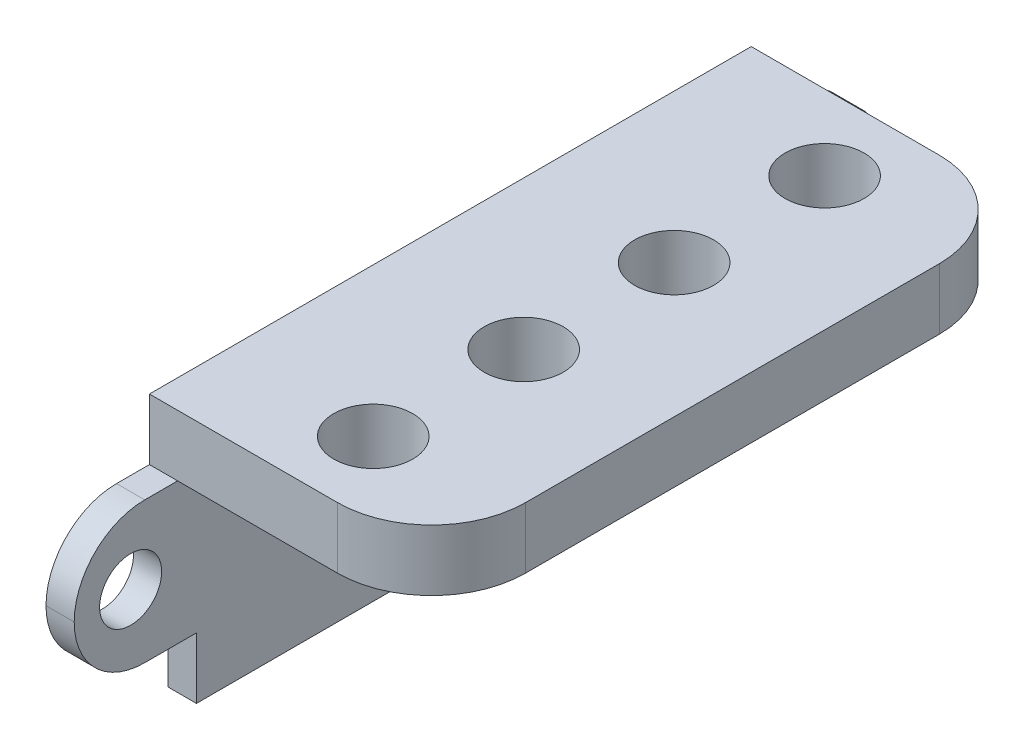
ISO-10303-21;
HEADER;
FILE_DESCRIPTION(('STEP AP214'),'2;1');
FILE_NAME('part.step','',(''),(''),'','','');
FILE_SCHEMA(('AUTOMOTIVE_DESIGN { 1 0 10303 214 1 1 1 1 }'));
ENDSEC;
DATA;
#1=APPLICATION_CONTEXT('core data for automotive mechanical design processes');
#2=APPLICATION_PROTOCOL_DEFINITION('international standard','automotive_design',2000,#1);
#3=PRODUCT_CONTEXT('',#1,'mechanical');
#4=PRODUCT('Part','Part','',(#3));
#5=PRODUCT_RELATED_PRODUCT_CATEGORY('part','',(#4));
#6=PRODUCT_DEFINITION_FORMATION('','',#4);
#7=PRODUCT_DEFINITION_CONTEXT('part definition',#1,'design');
#8=PRODUCT_DEFINITION('design','',#6,#7);
#9=PRODUCT_DEFINITION_SHAPE('','',#8);
#10=(LENGTH_UNIT() NAMED_UNIT(*) SI_UNIT(.MILLI.,.METRE.));
#11=(NAMED_UNIT(*) PLANE_ANGLE_UNIT() SI_UNIT($,.RADIAN.));
#12=(NAMED_UNIT(*) SI_UNIT($,.STERADIAN.) SOLID_ANGLE_UNIT());
#13=UNCERTAINTY_MEASURE_WITH_UNIT(LENGTH_MEASURE(1.E-05),#10,'distance_accuracy_value','');
#14=(GEOMETRIC_REPRESENTATION_CONTEXT(3) GLOBAL_UNCERTAINTY_ASSIGNED_CONTEXT((#13)) GLOBAL_UNIT_ASSIGNED_CONTEXT((#10,
#11,#12)) REPRESENTATION_CONTEXT('',''));
#15=CARTESIAN_POINT('',(0.,0.,0.));
#16=DIRECTION('',(0.,0.,1.));
#17=DIRECTION('',(1.,0.,0.));
#18=AXIS2_PLACEMENT_3D('',#15,#16,#17);
#19=CARTESIAN_POINT('',(1.5,0.,0.));
#20=DIRECTION('',(1.,0.,0.));
#21=DIRECTION('',(0.,0.,-1.));
#22=AXIS2_PLACEMENT_3D('',#19,#20,#21);
#23=PLANE('',#22);
#24=CARTESIAN_POINT('',(1.5,0.,-18.5));
#25=DIRECTION('',(1.,0.,0.));
#26=DIRECTION('',(0.,0.,-1.));
#27=AXIS2_PLACEMENT_3D('',#24,#25,#26);
#28=CIRCLE('',#27,1.65);
#29=CARTESIAN_POINT('',(1.5,0.,-20.15));
#30=VERTEX_POINT('',#29);
#31=EDGE_CURVE('E219',#30,#30,#28,.T.);
#32=ORIENTED_EDGE('',*,*,#31,.F.);
#33=EDGE_LOOP('',(#32));
#34=FACE_BOUND('',#33,.T.);
#35=CARTESIAN_POINT('',(1.5,0.,18.5));
#36=DIRECTION('',(1.,0.,0.));
#37=DIRECTION('',(0.,0.,-1.));
#38=AXIS2_PLACEMENT_3D('',#35,#36,#37);
#39=CIRCLE('',#38,1.65);
#40=CARTESIAN_POINT('',(1.5,0.,16.85));
#41=VERTEX_POINT('',#40);
#42=EDGE_CURVE('E224',#41,#41,#39,.T.);
#43=ORIENTED_EDGE('',*,*,#42,.F.);
#44=EDGE_LOOP('',(#43));
#45=FACE_BOUND('',#44,.T.);
#46=DIRECTION('',(0.,0.,1.));
#47=VECTOR('',#46,1.);
#48=CARTESIAN_POINT('',(1.5,3.75,21.5));
#49=LINE('',#48,#47);
#50=CARTESIAN_POINT('',(1.5,3.75,-17.75));
#51=VERTEX_POINT('',#50);
#52=CARTESIAN_POINT('',(1.5,3.75,-16.));
#53=VERTEX_POINT('',#52);
#54=EDGE_CURVE('E228',#51,#53,#49,.T.);
#55=ORIENTED_EDGE('',*,*,#54,.T.);
#56=CARTESIAN_POINT('',(1.5,3.75,16.));
#57=VERTEX_POINT('',#56);
#58=EDGE_CURVE('E232',#53,#57,#49,.T.);
#59=ORIENTED_EDGE('',*,*,#58,.T.);
#60=CARTESIAN_POINT('',(1.5,3.75,17.75));
#61=VERTEX_POINT('',#60);
#62=EDGE_CURVE('E233',#57,#61,#49,.T.);
#63=ORIENTED_EDGE('',*,*,#62,.T.);
#64=CARTESIAN_POINT('',(1.5,0.,17.75));
#65=DIRECTION('',(1.,0.,0.));
#66=DIRECTION('',(0.,0.,-1.));
#67=AXIS2_PLACEMENT_3D('',#64,#65,#66);
#68=CIRCLE('',#67,3.75);
#69=CARTESIAN_POINT('',(1.5,0.,21.5));
#70=VERTEX_POINT('',#69);
#71=EDGE_CURVE('E261',#61,#70,#68,.T.);
#72=ORIENTED_EDGE('',*,*,#71,.T.);
#73=CARTESIAN_POINT('',(1.5,0.,17.75));
#74=DIRECTION('',(1.,0.,0.));
#75=DIRECTION('',(0.,0.,-1.));
#76=AXIS2_PLACEMENT_3D('',#73,#74,#75);
#77=CIRCLE('',#76,3.75);
#78=CARTESIAN_POINT('',(1.5,-3.75,17.75));
#79=VERTEX_POINT('',#78);
#80=EDGE_CURVE('E263',#70,#79,#77,.T.);
#81=ORIENTED_EDGE('',*,*,#80,.T.);
#82=DIRECTION('',(0.,0.,-1.));
#83=VECTOR('',#82,1.);
#84=CARTESIAN_POINT('',(1.5,-3.75,21.5));
#85=LINE('',#84,#83);
#86=CARTESIAN_POINT('',(1.5,-3.75,15.));
#87=VERTEX_POINT('',#86);
#88=EDGE_CURVE('E234',#79,#87,#85,.T.);
#89=ORIENTED_EDGE('',*,*,#88,.T.);
#90=DIRECTION('',(0.,1.,0.));
#91=VECTOR('',#90,1.);
#92=CARTESIAN_POINT('',(1.5,-7.,15.));
#93=LINE('',#92,#91);
#94=CARTESIAN_POINT('',(1.5,-7.,15.));
#95=VERTEX_POINT('',#94);
#96=EDGE_CURVE('E199',#95,#87,#93,.T.);
#97=ORIENTED_EDGE('',*,*,#96,.F.);
#98=DIRECTION('',(0.,0.,1.));
#99=VECTOR('',#98,1.);
#100=CARTESIAN_POINT('',(1.5,-7.,15.));
#101=LINE('',#100,#99);
#102=CARTESIAN_POINT('',(1.5,-7.,-15.));
#103=VERTEX_POINT('',#102);
#104=EDGE_CURVE('E196',#103,#95,#101,.T.);
#105=ORIENTED_EDGE('',*,*,#104,.F.);
#106=DIRECTION('',(0.,-1.,0.));
#107=VECTOR('',#106,1.);
#108=CARTESIAN_POINT('',(1.5,-7.,-15.));
#109=LINE('',#108,#107);
#110=CARTESIAN_POINT('',(1.5,-3.75,-15.));
#111=VERTEX_POINT('',#110);
#112=EDGE_CURVE('E164',#111,#103,#109,.T.);
#113=ORIENTED_EDGE('',*,*,#112,.F.);
#114=CARTESIAN_POINT('',(1.5,-3.75,-17.75));
#115=VERTEX_POINT('',#114);
#116=EDGE_CURVE('E231',#111,#115,#85,.T.);
#117=ORIENTED_EDGE('',*,*,#116,.T.);
#118=CARTESIAN_POINT('',(1.5,0.,-17.75));
#119=DIRECTION('',(1.,0.,0.));
#120=DIRECTION('',(0.,0.,-1.));
#121=AXIS2_PLACEMENT_3D('',#118,#119,#120);
#122=CIRCLE('',#121,3.75);
#123=CARTESIAN_POINT('',(1.5,0.,-21.5));
#124=VERTEX_POINT('',#123);
#125=EDGE_CURVE('E267',#115,#124,#122,.T.);
#126=ORIENTED_EDGE('',*,*,#125,.T.);
#127=CARTESIAN_POINT('',(1.5,0.,-17.75));
#128=DIRECTION('',(1.,0.,0.));
#129=DIRECTION('',(0.,0.,-1.));
#130=AXIS2_PLACEMENT_3D('',#127,#128,#129);
#131=CIRCLE('',#130,3.75);
#132=EDGE_CURVE('E265',#124,#51,#131,.T.);
#133=ORIENTED_EDGE('',*,*,#132,.T.);
#134=EDGE_LOOP('',(#55,#59,#63,#72,#81,#89,#97,#105,#113,#117,#126,#133));
#135=FACE_BOUND('',#134,.T.);
#136=ADVANCED_FACE('F32',(#34,#45,#135),#23,.T.);
#137=CARTESIAN_POINT('',(1.5,3.75,21.5));
#138=DIRECTION('',(0.,-1.,0.));
#139=DIRECTION('',(0.,0.,-1.));
#140=AXIS2_PLACEMENT_3D('',#137,#138,#139);
#141=PLANE('',#140);
#142=DIRECTION('',(0.,0.,1.));
#143=VECTOR('',#142,1.);
#144=CARTESIAN_POINT('',(0.,3.75,21.5));
#145=LINE('',#144,#143);
#146=CARTESIAN_POINT('',(0.,3.75,-17.75));
#147=VERTEX_POINT('',#146);
#148=CARTESIAN_POINT('',(0.,3.75,-16.));
#149=VERTEX_POINT('',#148);
#150=EDGE_CURVE('E238',#147,#149,#145,.T.);
#151=ORIENTED_EDGE('',*,*,#150,.T.);
#152=DIRECTION('',(-1.,0.,0.));
#153=VECTOR('',#152,1.);
#154=CARTESIAN_POINT('',(0.,3.74999999999999,-16.));
#155=LINE('',#154,#153);
#156=EDGE_CURVE('E299',#53,#149,#155,.T.);
#157=ORIENTED_EDGE('',*,*,#156,.F.);
#158=ORIENTED_EDGE('',*,*,#54,.F.);
#159=DIRECTION('',(-1.,0.,0.));
#160=VECTOR('',#159,1.);
#161=CARTESIAN_POINT('',(1.5,3.75,-17.75));
#162=LINE('',#161,#160);
#163=EDGE_CURVE('E272',#51,#147,#162,.T.);
#164=ORIENTED_EDGE('',*,*,#163,.T.);
#165=EDGE_LOOP('',(#151,#157,#158,#164));
#166=FACE_BOUND('',#165,.T.);
#167=ADVANCED_FACE('F399',(#166),#141,.F.);
#168=CARTESIAN_POINT('',(1.5,-3.75,21.5));
#169=DIRECTION('',(0.,1.,0.));
#170=DIRECTION('',(0.,0.,1.));
#171=AXIS2_PLACEMENT_3D('',#168,#169,#170);
#172=PLANE('',#171);
#173=ORIENTED_EDGE('',*,*,#116,.F.);
#174=DIRECTION('',(-1.,0.,0.));
#175=VECTOR('',#174,1.);
#176=CARTESIAN_POINT('',(1.5,-3.75,-15.));
#177=LINE('',#176,#175);
#178=CARTESIAN_POINT('',(0.,-3.75,-15.));
#179=VERTEX_POINT('',#178);
#180=EDGE_CURVE('E215',#111,#179,#177,.T.);
#181=ORIENTED_EDGE('',*,*,#180,.T.);
#182=DIRECTION('',(0.,0.,-1.));
#183=VECTOR('',#182,1.);
#184=CARTESIAN_POINT('',(0.,-3.75,21.5));
#185=LINE('',#184,#183);
#186=CARTESIAN_POINT('',(0.,-3.75,-17.75));
#187=VERTEX_POINT('',#186);
#188=EDGE_CURVE('E240',#179,#187,#185,.T.);
#189=ORIENTED_EDGE('',*,*,#188,.T.);
#190=DIRECTION('',(-1.,0.,0.));
#191=VECTOR('',#190,1.);
#192=CARTESIAN_POINT('',(1.5,-3.75,-17.75));
#193=LINE('',#192,#191);
#194=EDGE_CURVE('E258',#187,#115,#193,.F.);
#195=ORIENTED_EDGE('',*,*,#194,.T.);
#196=EDGE_LOOP('',(#173,#181,#189,#195));
#197=FACE_BOUND('',#196,.T.);
#198=ADVANCED_FACE('F321',(#197),#172,.F.);
#199=ORIENTED_EDGE('',*,*,#62,.F.);
#200=DIRECTION('',(1.,0.,0.));
#201=VECTOR('',#200,1.);
#202=CARTESIAN_POINT('',(0.,3.75,16.));
#203=LINE('',#202,#201);
#204=CARTESIAN_POINT('',(0.,3.75,16.));
#205=VERTEX_POINT('',#204);
#206=EDGE_CURVE('E300',#205,#57,#203,.T.);
#207=ORIENTED_EDGE('',*,*,#206,.F.);
#208=CARTESIAN_POINT('',(0.,3.75,17.75));
#209=VERTEX_POINT('',#208);
#210=EDGE_CURVE('E173',#205,#209,#145,.T.);
#211=ORIENTED_EDGE('',*,*,#210,.T.);
#212=DIRECTION('',(-1.,0.,0.));
#213=VECTOR('',#212,1.);
#214=CARTESIAN_POINT('',(1.5,3.75,17.75));
#215=LINE('',#214,#213);
#216=EDGE_CURVE('E269',#209,#61,#215,.F.);
#217=ORIENTED_EDGE('',*,*,#216,.T.);
#218=EDGE_LOOP('',(#199,#207,#211,#217));
#219=FACE_BOUND('',#218,.T.);
#220=ADVANCED_FACE('F351',(#219),#141,.F.);
#221=CARTESIAN_POINT('',(0.,-3.75,17.75));
#222=VERTEX_POINT('',#221);
#223=CARTESIAN_POINT('',(0.,-3.75,15.));
#224=VERTEX_POINT('',#223);
#225=EDGE_CURVE('E241',#222,#224,#185,.T.);
#226=ORIENTED_EDGE('',*,*,#225,.T.);
#227=DIRECTION('',(1.,0.,0.));
#228=VECTOR('',#227,1.);
#229=CARTESIAN_POINT('',(1.5,-3.75,15.));
#230=LINE('',#229,#228);
#231=EDGE_CURVE('E211',#224,#87,#230,.T.);
#232=ORIENTED_EDGE('',*,*,#231,.T.);
#233=ORIENTED_EDGE('',*,*,#88,.F.);
#234=DIRECTION('',(-1.,0.,0.));
#235=VECTOR('',#234,1.);
#236=CARTESIAN_POINT('',(1.5,-3.75,17.75));
#237=LINE('',#236,#235);
#238=EDGE_CURVE('E255',#79,#222,#237,.T.);
#239=ORIENTED_EDGE('',*,*,#238,.T.);
#240=EDGE_LOOP('',(#226,#232,#233,#239));
#241=FACE_BOUND('',#240,.T.);
#242=ADVANCED_FACE('F338',(#241),#172,.F.);
#243=CARTESIAN_POINT('',(0.,0.,0.));
#244=DIRECTION('',(1.,0.,0.));
#245=DIRECTION('',(0.,0.,-1.));
#246=AXIS2_PLACEMENT_3D('',#243,#244,#245);
#247=PLANE('',#246);
#248=DIRECTION('',(0.,0.,-1.));
#249=VECTOR('',#248,1.);
#250=CARTESIAN_POINT('',(0.,7.,15.));
#251=LINE('',#250,#249);
#252=CARTESIAN_POINT('',(0.,7.,16.));
#253=VERTEX_POINT('',#252);
#254=CARTESIAN_POINT('',(0.,7.,-16.));
#255=VERTEX_POINT('',#254);
#256=EDGE_CURVE('E154',#253,#255,#251,.T.);
#257=ORIENTED_EDGE('',*,*,#256,.T.);
#258=DIRECTION('',(0.,1.,0.));
#259=VECTOR('',#258,1.);
#260=CARTESIAN_POINT('',(0.,3.74999999999999,-16.));
#261=LINE('',#260,#259);
#262=EDGE_CURVE('E176',#149,#255,#261,.T.);
#263=ORIENTED_EDGE('',*,*,#262,.F.);
#264=ORIENTED_EDGE('',*,*,#150,.F.);
#265=CARTESIAN_POINT('',(0.,0.,-17.75));
#266=DIRECTION('',(1.,0.,0.));
#267=DIRECTION('',(0.,0.,-1.));
#268=AXIS2_PLACEMENT_3D('',#265,#266,#267);
#269=CIRCLE('',#268,3.75);
#270=CARTESIAN_POINT('',(0.,0.,-21.5));
#271=VERTEX_POINT('',#270);
#272=EDGE_CURVE('E250',#147,#271,#269,.F.);
#273=ORIENTED_EDGE('',*,*,#272,.T.);
#274=CARTESIAN_POINT('',(0.,0.,-17.75));
#275=DIRECTION('',(1.,0.,0.));
#276=DIRECTION('',(0.,0.,-1.));
#277=AXIS2_PLACEMENT_3D('',#274,#275,#276);
#278=CIRCLE('',#277,3.75);
#279=EDGE_CURVE('E252',#271,#187,#278,.F.);
#280=ORIENTED_EDGE('',*,*,#279,.T.);
#281=ORIENTED_EDGE('',*,*,#188,.F.);
#282=DIRECTION('',(0.,-1.,0.));
#283=VECTOR('',#282,1.);
#284=CARTESIAN_POINT('',(0.,-7.,-15.));
#285=LINE('',#284,#283);
#286=CARTESIAN_POINT('',(0.,-7.,-15.));
#287=VERTEX_POINT('',#286);
#288=EDGE_CURVE('E193',#179,#287,#285,.T.);
#289=ORIENTED_EDGE('',*,*,#288,.T.);
#290=DIRECTION('',(0.,0.,1.));
#291=VECTOR('',#290,1.);
#292=CARTESIAN_POINT('',(0.,-7.,15.));
#293=LINE('',#292,#291);
#294=CARTESIAN_POINT('',(0.,-7.,15.));
#295=VERTEX_POINT('',#294);
#296=EDGE_CURVE('E204',#287,#295,#293,.T.);
#297=ORIENTED_EDGE('',*,*,#296,.T.);
#298=DIRECTION('',(0.,1.,0.));
#299=VECTOR('',#298,1.);
#300=CARTESIAN_POINT('',(0.,-7.,15.));
#301=LINE('',#300,#299);
#302=EDGE_CURVE('E165',#295,#224,#301,.T.);
#303=ORIENTED_EDGE('',*,*,#302,.T.);
#304=ORIENTED_EDGE('',*,*,#225,.F.);
#305=CARTESIAN_POINT('',(0.,0.,17.75));
#306=DIRECTION('',(1.,0.,0.));
#307=DIRECTION('',(0.,0.,-1.));
#308=AXIS2_PLACEMENT_3D('',#305,#306,#307);
#309=CIRCLE('',#308,3.75);
#310=CARTESIAN_POINT('',(0.,0.,21.5));
#311=VERTEX_POINT('',#310);
#312=EDGE_CURVE('E248',#222,#311,#309,.F.);
#313=ORIENTED_EDGE('',*,*,#312,.T.);
#314=CARTESIAN_POINT('',(0.,0.,17.75));
#315=DIRECTION('',(1.,0.,0.));
#316=DIRECTION('',(0.,0.,-1.));
#317=AXIS2_PLACEMENT_3D('',#314,#315,#316);
#318=CIRCLE('',#317,3.75);
#319=EDGE_CURVE('E237',#311,#209,#318,.F.);
#320=ORIENTED_EDGE('',*,*,#319,.T.);
#321=ORIENTED_EDGE('',*,*,#210,.F.);
#322=DIRECTION('',(0.,1.,0.));
#323=VECTOR('',#322,1.);
#324=CARTESIAN_POINT('',(0.,3.75,16.));
#325=LINE('',#324,#323);
#326=EDGE_CURVE('E169',#205,#253,#325,.T.);
#327=ORIENTED_EDGE('',*,*,#326,.T.);
#328=EDGE_LOOP('',(#257,#263,#264,#273,#280,#281,#289,#297,#303,#304,#313,#320,#321,#327));
#329=FACE_BOUND('',#328,.T.);
#330=CARTESIAN_POINT('',(0.,0.,-18.5));
#331=DIRECTION('',(1.,0.,0.));
#332=DIRECTION('',(0.,0.,-1.));
#333=AXIS2_PLACEMENT_3D('',#330,#331,#332);
#334=CIRCLE('',#333,1.65);
#335=CARTESIAN_POINT('',(0.,0.,-20.15));
#336=VERTEX_POINT('',#335);
#337=EDGE_CURVE('E222',#336,#336,#334,.T.);
#338=ORIENTED_EDGE('',*,*,#337,.T.);
#339=EDGE_LOOP('',(#338));
#340=FACE_BOUND('',#339,.T.);
#341=CARTESIAN_POINT('',(0.,0.,18.5));
#342=DIRECTION('',(1.,0.,0.));
#343=DIRECTION('',(0.,0.,-1.));
#344=AXIS2_PLACEMENT_3D('',#341,#342,#343);
#345=CIRCLE('',#344,1.65);
#346=CARTESIAN_POINT('',(0.,0.,16.85));
#347=VERTEX_POINT('',#346);
#348=EDGE_CURVE('E227',#347,#347,#345,.T.);
#349=ORIENTED_EDGE('',*,*,#348,.T.);
#350=EDGE_LOOP('',(#349));
#351=FACE_BOUND('',#350,.T.);
#352=ADVANCED_FACE('F170',(#329,#340,#351),#247,.F.);
#353=CARTESIAN_POINT('',(-10.,0.,18.5));
#354=DIRECTION('',(1.,0.,0.));
#355=DIRECTION('',(0.,0.,-1.));
#356=AXIS2_PLACEMENT_3D('',#353,#354,#355);
#357=CYLINDRICAL_SURFACE('',#356,1.65);
#358=ORIENTED_EDGE('',*,*,#42,.T.);
#359=EDGE_LOOP('',(#358));
#360=FACE_BOUND('',#359,.T.);
#361=ORIENTED_EDGE('',*,*,#348,.F.);
#362=EDGE_LOOP('',(#361));
#363=FACE_BOUND('',#362,.T.);
#364=ADVANCED_FACE('F410',(#360,#363),#357,.F.);
#365=CARTESIAN_POINT('',(-10.,0.,-18.5));
#366=DIRECTION('',(1.,0.,0.));
#367=DIRECTION('',(0.,0.,-1.));
#368=AXIS2_PLACEMENT_3D('',#365,#366,#367);
#369=CYLINDRICAL_SURFACE('',#368,1.65);
#370=ORIENTED_EDGE('',*,*,#31,.T.);
#371=EDGE_LOOP('',(#370));
#372=FACE_BOUND('',#371,.T.);
#373=ORIENTED_EDGE('',*,*,#337,.F.);
#374=EDGE_LOOP('',(#373));
#375=FACE_BOUND('',#374,.T.);
#376=ADVANCED_FACE('F421',(#372,#375),#369,.F.);
#377=CARTESIAN_POINT('',(1.5,0.,-17.75));
#378=DIRECTION('',(-1.,0.,0.));
#379=DIRECTION('',(0.,0.,1.));
#380=AXIS2_PLACEMENT_3D('',#377,#378,#379);
#381=CYLINDRICAL_SURFACE('',#380,3.75);
#382=ORIENTED_EDGE('',*,*,#163,.F.);
#383=ORIENTED_EDGE('',*,*,#132,.F.);
#384=DIRECTION('',(-1.,0.,0.));
#385=VECTOR('',#384,1.);
#386=CARTESIAN_POINT('',(1.5,0.,-21.5));
#387=LINE('',#386,#385);
#388=EDGE_CURVE('E223',#271,#124,#387,.F.);
#389=ORIENTED_EDGE('',*,*,#388,.F.);
#390=ORIENTED_EDGE('',*,*,#272,.F.);
#391=EDGE_LOOP('',(#382,#383,#389,#390));
#392=FACE_BOUND('',#391,.T.);
#393=ADVANCED_FACE('F311',(#392),#381,.T.);
#394=CARTESIAN_POINT('',(1.5,0.,-17.75));
#395=DIRECTION('',(-1.,0.,0.));
#396=DIRECTION('',(0.,0.,1.));
#397=AXIS2_PLACEMENT_3D('',#394,#395,#396);
#398=CYLINDRICAL_SURFACE('',#397,3.75);
#399=ORIENTED_EDGE('',*,*,#125,.F.);
#400=ORIENTED_EDGE('',*,*,#194,.F.);
#401=ORIENTED_EDGE('',*,*,#279,.F.);
#402=ORIENTED_EDGE('',*,*,#388,.T.);
#403=EDGE_LOOP('',(#399,#400,#401,#402));
#404=FACE_BOUND('',#403,.T.);
#405=ADVANCED_FACE('F317',(#404),#398,.T.);
#406=CARTESIAN_POINT('',(1.5,0.,17.75));
#407=DIRECTION('',(-1.,0.,0.));
#408=DIRECTION('',(0.,0.,1.));
#409=AXIS2_PLACEMENT_3D('',#406,#407,#408);
#410=CYLINDRICAL_SURFACE('',#409,3.75);
#411=DIRECTION('',(-1.,0.,0.));
#412=VECTOR('',#411,1.);
#413=CARTESIAN_POINT('',(1.5,0.,21.5));
#414=LINE('',#413,#412);
#415=EDGE_CURVE('E218',#70,#311,#414,.T.);
#416=ORIENTED_EDGE('',*,*,#415,.F.);
#417=ORIENTED_EDGE('',*,*,#71,.F.);
#418=ORIENTED_EDGE('',*,*,#216,.F.);
#419=ORIENTED_EDGE('',*,*,#319,.F.);
#420=EDGE_LOOP('',(#416,#417,#418,#419));
#421=FACE_BOUND('',#420,.T.);
#422=ADVANCED_FACE('F349',(#421),#410,.T.);
#423=CARTESIAN_POINT('',(1.5,0.,17.75));
#424=DIRECTION('',(-1.,0.,0.));
#425=DIRECTION('',(0.,0.,1.));
#426=AXIS2_PLACEMENT_3D('',#423,#424,#425);
#427=CYLINDRICAL_SURFACE('',#426,3.75);
#428=ORIENTED_EDGE('',*,*,#80,.F.);
#429=ORIENTED_EDGE('',*,*,#415,.T.);
#430=ORIENTED_EDGE('',*,*,#312,.F.);
#431=ORIENTED_EDGE('',*,*,#238,.F.);
#432=EDGE_LOOP('',(#428,#429,#430,#431));
#433=FACE_BOUND('',#432,.T.);
#434=ADVANCED_FACE('F345',(#433),#427,.T.);
#435=CARTESIAN_POINT('',(1.5,-7.,15.));
#436=DIRECTION('',(0.,-1.,0.));
#437=DIRECTION('',(0.,0.,-1.));
#438=AXIS2_PLACEMENT_3D('',#435,#436,#437);
#439=PLANE('',#438);
#440=ORIENTED_EDGE('',*,*,#296,.F.);
#441=DIRECTION('',(-1.,0.,0.));
#442=VECTOR('',#441,1.);
#443=CARTESIAN_POINT('',(1.5,-7.,-15.));
#444=LINE('',#443,#442);
#445=EDGE_CURVE('E202',#103,#287,#444,.T.);
#446=ORIENTED_EDGE('',*,*,#445,.F.);
#447=ORIENTED_EDGE('',*,*,#104,.T.);
#448=DIRECTION('',(-1.,0.,0.));
#449=VECTOR('',#448,1.);
#450=CARTESIAN_POINT('',(1.5,-7.,15.));
#451=LINE('',#450,#449);
#452=EDGE_CURVE('E209',#95,#295,#451,.T.);
#453=ORIENTED_EDGE('',*,*,#452,.T.);
#454=EDGE_LOOP('',(#440,#446,#447,#453));
#455=FACE_BOUND('',#454,.T.);
#456=ADVANCED_FACE('F329',(#455),#439,.T.);
#457=CARTESIAN_POINT('',(1.5,-7.,15.));
#458=DIRECTION('',(0.,0.,1.));
#459=DIRECTION('',(1.,0.,0.));
#460=AXIS2_PLACEMENT_3D('',#457,#458,#459);
#461=PLANE('',#460);
#462=ORIENTED_EDGE('',*,*,#231,.F.);
#463=ORIENTED_EDGE('',*,*,#302,.F.);
#464=ORIENTED_EDGE('',*,*,#452,.F.);
#465=ORIENTED_EDGE('',*,*,#96,.T.);
#466=EDGE_LOOP('',(#462,#463,#464,#465));
#467=FACE_BOUND('',#466,.T.);
#468=ADVANCED_FACE('F334',(#467),#461,.T.);
#469=CARTESIAN_POINT('',(1.5,-7.,-15.));
#470=DIRECTION('',(0.,0.,-1.));
#471=DIRECTION('',(-1.,0.,0.));
#472=AXIS2_PLACEMENT_3D('',#469,#470,#471);
#473=PLANE('',#472);
#474=ORIENTED_EDGE('',*,*,#180,.F.);
#475=ORIENTED_EDGE('',*,*,#112,.T.);
#476=ORIENTED_EDGE('',*,*,#445,.T.);
#477=ORIENTED_EDGE('',*,*,#288,.F.);
#478=EDGE_LOOP('',(#474,#475,#476,#477));
#479=FACE_BOUND('',#478,.T.);
#480=ADVANCED_FACE('F324',(#479),#473,.T.);
#481=CARTESIAN_POINT('',(1.5,7.,15.));
#482=DIRECTION('',(0.,1.,0.));
#483=DIRECTION('',(0.,0.,1.));
#484=AXIS2_PLACEMENT_3D('',#481,#482,#483);
#485=PLANE('',#484);
#486=CARTESIAN_POINT('',(7.90000000000025,7.,-12.));
#487=DIRECTION('',(0.,1.,0.));
#488=DIRECTION('',(0.,0.,1.));
#489=AXIS2_PLACEMENT_3D('',#486,#487,#488);
#490=CIRCLE('',#489,2.1);
#491=CARTESIAN_POINT('',(7.90000000000025,7.,-9.9));
#492=VERTEX_POINT('',#491);
#493=EDGE_CURVE('E369',#492,#492,#490,.T.);
#494=ORIENTED_EDGE('',*,*,#493,.F.);
#495=EDGE_LOOP('',(#494));
#496=FACE_BOUND('',#495,.T.);
#497=CARTESIAN_POINT('',(7.90000000000017,7.,-4.));
#498=DIRECTION('',(0.,1.,0.));
#499=DIRECTION('',(0.,0.,1.));
#500=AXIS2_PLACEMENT_3D('',#497,#498,#499);
#501=CIRCLE('',#500,2.1);
#502=CARTESIAN_POINT('',(7.90000000000017,7.,-1.9));
#503=VERTEX_POINT('',#502);
#504=EDGE_CURVE('E363',#503,#503,#501,.T.);
#505=ORIENTED_EDGE('',*,*,#504,.F.);
#506=EDGE_LOOP('',(#505));
#507=FACE_BOUND('',#506,.T.);
#508=CARTESIAN_POINT('',(7.90000000000008,7.,4.));
#509=DIRECTION('',(0.,1.,0.));
#510=DIRECTION('',(0.,0.,1.));
#511=AXIS2_PLACEMENT_3D('',#508,#509,#510);
#512=CIRCLE('',#511,2.1);
#513=CARTESIAN_POINT('',(7.90000000000008,7.,6.1));
#514=VERTEX_POINT('',#513);
#515=EDGE_CURVE('E357',#514,#514,#512,.T.);
#516=ORIENTED_EDGE('',*,*,#515,.F.);
#517=EDGE_LOOP('',(#516));
#518=FACE_BOUND('',#517,.T.);
#519=CARTESIAN_POINT('',(7.9,7.,12.));
#520=DIRECTION('',(0.,1.,0.));
#521=DIRECTION('',(0.,0.,1.));
#522=AXIS2_PLACEMENT_3D('',#519,#520,#521);
#523=CIRCLE('',#522,2.1);
#524=CARTESIAN_POINT('',(7.9,7.,14.1));
#525=VERTEX_POINT('',#524);
#526=EDGE_CURVE('E182',#525,#525,#523,.T.);
#527=ORIENTED_EDGE('',*,*,#526,.F.);
#528=EDGE_LOOP('',(#527));
#529=FACE_BOUND('',#528,.T.);
#530=DIRECTION('',(0.,0.,-1.));
#531=VECTOR('',#530,1.);
#532=CARTESIAN_POINT('',(15.,7.,-16.));
#533=LINE('',#532,#531);
#534=CARTESIAN_POINT('',(15.,7.,11.));
#535=VERTEX_POINT('',#534);
#536=CARTESIAN_POINT('',(15.,7.,-11.));
#537=VERTEX_POINT('',#536);
#538=EDGE_CURVE('E181',#535,#537,#533,.T.);
#539=ORIENTED_EDGE('',*,*,#538,.T.);
#540=CARTESIAN_POINT('',(10.,7.,-11.));
#541=DIRECTION('',(0.,1.,0.));
#542=DIRECTION('',(0.,0.,1.));
#543=AXIS2_PLACEMENT_3D('',#540,#541,#542);
#544=CIRCLE('',#543,5.);
#545=CARTESIAN_POINT('',(10.,7.,-16.));
#546=VERTEX_POINT('',#545);
#547=EDGE_CURVE('E285',#537,#546,#544,.T.);
#548=ORIENTED_EDGE('',*,*,#547,.T.);
#549=DIRECTION('',(-1.,0.,0.));
#550=VECTOR('',#549,1.);
#551=CARTESIAN_POINT('',(0.,7.,-16.));
#552=LINE('',#551,#550);
#553=EDGE_CURVE('E160',#546,#255,#552,.T.);
#554=ORIENTED_EDGE('',*,*,#553,.T.);
#555=ORIENTED_EDGE('',*,*,#256,.F.);
#556=DIRECTION('',(1.,0.,0.));
#557=VECTOR('',#556,1.);
#558=CARTESIAN_POINT('',(0.,7.,16.));
#559=LINE('',#558,#557);
#560=CARTESIAN_POINT('',(10.,7.,16.));
#561=VERTEX_POINT('',#560);
#562=EDGE_CURVE('E159',#253,#561,#559,.T.);
#563=ORIENTED_EDGE('',*,*,#562,.T.);
#564=CARTESIAN_POINT('',(10.,7.,11.));
#565=DIRECTION('',(0.,1.,0.));
#566=DIRECTION('',(0.,0.,1.));
#567=AXIS2_PLACEMENT_3D('',#564,#565,#566);
#568=CIRCLE('',#567,5.);
#569=EDGE_CURVE('E283',#561,#535,#568,.T.);
#570=ORIENTED_EDGE('',*,*,#569,.T.);
#571=EDGE_LOOP('',(#539,#548,#554,#555,#563,#570));
#572=FACE_BOUND('',#571,.T.);
#573=ADVANCED_FACE('F157',(#496,#507,#518,#529,#572),#485,.T.);
#574=CARTESIAN_POINT('',(0.,3.74999999999999,-16.));
#575=DIRECTION('',(0.,0.,-1.));
#576=DIRECTION('',(0.,1.,0.));
#577=AXIS2_PLACEMENT_3D('',#574,#575,#576);
#578=PLANE('',#577);
#579=ORIENTED_EDGE('',*,*,#553,.F.);
#580=DIRECTION('',(0.,1.,0.));
#581=VECTOR('',#580,1.);
#582=CARTESIAN_POINT('',(10.,3.74999999999999,-16.));
#583=LINE('',#582,#581);
#584=CARTESIAN_POINT('',(10.,3.74999999999999,-16.));
#585=VERTEX_POINT('',#584);
#586=EDGE_CURVE('E55',#546,#585,#583,.F.);
#587=ORIENTED_EDGE('',*,*,#586,.T.);
#588=EDGE_CURVE('E177',#585,#53,#155,.T.);
#589=ORIENTED_EDGE('',*,*,#588,.T.);
#590=ORIENTED_EDGE('',*,*,#156,.T.);
#591=ORIENTED_EDGE('',*,*,#262,.T.);
#592=EDGE_LOOP('',(#579,#587,#589,#590,#591));
#593=FACE_BOUND('',#592,.T.);
#594=ADVANCED_FACE('F302',(#593),#578,.T.);
#595=CARTESIAN_POINT('',(15.,3.74999999999999,-16.));
#596=DIRECTION('',(1.,0.,0.));
#597=DIRECTION('',(0.,0.,-1.));
#598=AXIS2_PLACEMENT_3D('',#595,#596,#597);
#599=PLANE('',#598);
#600=DIRECTION('',(0.,0.,-1.));
#601=VECTOR('',#600,1.);
#602=CARTESIAN_POINT('',(15.,3.74999999999999,-16.));
#603=LINE('',#602,#601);
#604=CARTESIAN_POINT('',(15.,3.75,11.));
#605=VERTEX_POINT('',#604);
#606=CARTESIAN_POINT('',(15.,3.75,-11.));
#607=VERTEX_POINT('',#606);
#608=EDGE_CURVE('E291',#605,#607,#603,.T.);
#609=ORIENTED_EDGE('',*,*,#608,.T.);
#610=DIRECTION('',(0.,1.,0.));
#611=VECTOR('',#610,1.);
#612=CARTESIAN_POINT('',(15.,3.75,-11.));
#613=LINE('',#612,#611);
#614=EDGE_CURVE('E280',#607,#537,#613,.T.);
#615=ORIENTED_EDGE('',*,*,#614,.T.);
#616=ORIENTED_EDGE('',*,*,#538,.F.);
#617=DIRECTION('',(0.,1.,0.));
#618=VECTOR('',#617,1.);
#619=CARTESIAN_POINT('',(15.,3.75,11.));
#620=LINE('',#619,#618);
#621=EDGE_CURVE('E274',#535,#605,#620,.F.);
#622=ORIENTED_EDGE('',*,*,#621,.T.);
#623=EDGE_LOOP('',(#609,#615,#616,#622));
#624=FACE_BOUND('',#623,.T.);
#625=ADVANCED_FACE('F296',(#624),#599,.T.);
#626=CARTESIAN_POINT('',(0.,3.75,16.));
#627=DIRECTION('',(0.,0.,1.));
#628=DIRECTION('',(1.,0.,0.));
#629=AXIS2_PLACEMENT_3D('',#626,#627,#628);
#630=PLANE('',#629);
#631=CARTESIAN_POINT('',(10.,3.75,16.));
#632=VERTEX_POINT('',#631);
#633=EDGE_CURVE('E192',#57,#632,#203,.T.);
#634=ORIENTED_EDGE('',*,*,#633,.T.);
#635=DIRECTION('',(0.,1.,0.));
#636=VECTOR('',#635,1.);
#637=CARTESIAN_POINT('',(10.,3.75,16.));
#638=LINE('',#637,#636);
#639=EDGE_CURVE('E11',#632,#561,#638,.T.);
#640=ORIENTED_EDGE('',*,*,#639,.T.);
#641=ORIENTED_EDGE('',*,*,#562,.F.);
#642=ORIENTED_EDGE('',*,*,#326,.F.);
#643=ORIENTED_EDGE('',*,*,#206,.T.);
#644=EDGE_LOOP('',(#634,#640,#641,#642,#643));
#645=FACE_BOUND('',#644,.T.);
#646=ADVANCED_FACE('F179',(#645),#630,.T.);
#647=CARTESIAN_POINT('',(0.,3.75,0.));
#648=DIRECTION('',(0.,1.,0.));
#649=DIRECTION('',(0.,0.,1.));
#650=AXIS2_PLACEMENT_3D('',#647,#648,#649);
#651=PLANE('',#650);
#652=CARTESIAN_POINT('',(7.90000000000025,3.75,-12.));
#653=DIRECTION('',(0.,-1.,0.));
#654=DIRECTION('',(0.,0.,-1.));
#655=AXIS2_PLACEMENT_3D('',#652,#653,#654);
#656=CIRCLE('',#655,2.1);
#657=CARTESIAN_POINT('',(7.90000000000025,3.74999999999999,-14.1));
#658=VERTEX_POINT('',#657);
#659=EDGE_CURVE('E372',#658,#658,#656,.T.);
#660=ORIENTED_EDGE('',*,*,#659,.F.);
#661=EDGE_LOOP('',(#660));
#662=FACE_BOUND('',#661,.T.);
#663=CARTESIAN_POINT('',(7.90000000000017,3.75,-4.));
#664=DIRECTION('',(0.,-1.,0.));
#665=DIRECTION('',(0.,0.,-1.));
#666=AXIS2_PLACEMENT_3D('',#663,#664,#665);
#667=CIRCLE('',#666,2.1);
#668=CARTESIAN_POINT('',(7.90000000000017,3.75,-6.1));
#669=VERTEX_POINT('',#668);
#670=EDGE_CURVE('E366',#669,#669,#667,.T.);
#671=ORIENTED_EDGE('',*,*,#670,.F.);
#672=EDGE_LOOP('',(#671));
#673=FACE_BOUND('',#672,.T.);
#674=CARTESIAN_POINT('',(7.90000000000008,3.75,4.));
#675=DIRECTION('',(0.,-1.,0.));
#676=DIRECTION('',(0.,0.,-1.));
#677=AXIS2_PLACEMENT_3D('',#674,#675,#676);
#678=CIRCLE('',#677,2.1);
#679=CARTESIAN_POINT('',(7.90000000000008,3.75,1.9));
#680=VERTEX_POINT('',#679);
#681=EDGE_CURVE('E360',#680,#680,#678,.T.);
#682=ORIENTED_EDGE('',*,*,#681,.F.);
#683=EDGE_LOOP('',(#682));
#684=FACE_BOUND('',#683,.T.);
#685=CARTESIAN_POINT('',(7.9,3.75,12.));
#686=DIRECTION('',(0.,-1.,0.));
#687=DIRECTION('',(0.,0.,-1.));
#688=AXIS2_PLACEMENT_3D('',#685,#686,#687);
#689=CIRCLE('',#688,2.1);
#690=CARTESIAN_POINT('',(7.9,3.75,9.9));
#691=VERTEX_POINT('',#690);
#692=EDGE_CURVE('E186',#691,#691,#689,.T.);
#693=ORIENTED_EDGE('',*,*,#692,.F.);
#694=EDGE_LOOP('',(#693));
#695=FACE_BOUND('',#694,.T.);
#696=ORIENTED_EDGE('',*,*,#588,.F.);
#697=CARTESIAN_POINT('',(10.,3.75,-11.));
#698=DIRECTION('',(0.,1.,0.));
#699=DIRECTION('',(0.,0.,1.));
#700=AXIS2_PLACEMENT_3D('',#697,#698,#699);
#701=CIRCLE('',#700,5.);
#702=EDGE_CURVE('E40',#585,#607,#701,.F.);
#703=ORIENTED_EDGE('',*,*,#702,.T.);
#704=ORIENTED_EDGE('',*,*,#608,.F.);
#705=CARTESIAN_POINT('',(10.,3.75,11.));
#706=DIRECTION('',(0.,1.,0.));
#707=DIRECTION('',(0.,0.,1.));
#708=AXIS2_PLACEMENT_3D('',#705,#706,#707);
#709=CIRCLE('',#708,5.);
#710=EDGE_CURVE('E47',#605,#632,#709,.F.);
#711=ORIENTED_EDGE('',*,*,#710,.T.);
#712=ORIENTED_EDGE('',*,*,#633,.F.);
#713=ORIENTED_EDGE('',*,*,#58,.F.);
#714=EDGE_LOOP('',(#696,#703,#704,#711,#712,#713));
#715=FACE_BOUND('',#714,.T.);
#716=ADVANCED_FACE('F290',(#662,#673,#684,#695,#715),#651,.F.);
#717=CARTESIAN_POINT('',(7.9,16.75,12.));
#718=DIRECTION('',(0.,-1.,0.));
#719=DIRECTION('',(0.,0.,-1.));
#720=AXIS2_PLACEMENT_3D('',#717,#718,#719);
#721=CYLINDRICAL_SURFACE('',#720,2.1);
#722=ORIENTED_EDGE('',*,*,#526,.T.);
#723=EDGE_LOOP('',(#722));
#724=FACE_BOUND('',#723,.T.);
#725=ORIENTED_EDGE('',*,*,#692,.T.);
#726=EDGE_LOOP('',(#725));
#727=FACE_BOUND('',#726,.T.);
#728=ADVANCED_FACE('F380',(#724,#727),#721,.F.);
#729=CARTESIAN_POINT('',(7.90000000000008,16.75,4.));
#730=DIRECTION('',(0.,-1.,0.));
#731=DIRECTION('',(0.,0.,-1.));
#732=AXIS2_PLACEMENT_3D('',#729,#730,#731);
#733=CYLINDRICAL_SURFACE('',#732,2.1);
#734=ORIENTED_EDGE('',*,*,#515,.T.);
#735=EDGE_LOOP('',(#734));
#736=FACE_BOUND('',#735,.T.);
#737=ORIENTED_EDGE('',*,*,#681,.T.);
#738=EDGE_LOOP('',(#737));
#739=FACE_BOUND('',#738,.T.);
#740=ADVANCED_FACE('F389',(#736,#739),#733,.F.);
#741=CARTESIAN_POINT('',(7.90000000000017,16.75,-4.));
#742=DIRECTION('',(0.,-1.,0.));
#743=DIRECTION('',(0.,0.,-1.));
#744=AXIS2_PLACEMENT_3D('',#741,#742,#743);
#745=CYLINDRICAL_SURFACE('',#744,2.1);
#746=ORIENTED_EDGE('',*,*,#504,.T.);
#747=EDGE_LOOP('',(#746));
#748=FACE_BOUND('',#747,.T.);
#749=ORIENTED_EDGE('',*,*,#670,.T.);
#750=EDGE_LOOP('',(#749));
#751=FACE_BOUND('',#750,.T.);
#752=ADVANCED_FACE('F395',(#748,#751),#745,.F.);
#753=CARTESIAN_POINT('',(7.90000000000025,16.75,-12.));
#754=DIRECTION('',(0.,-1.,0.));
#755=DIRECTION('',(0.,0.,-1.));
#756=AXIS2_PLACEMENT_3D('',#753,#754,#755);
#757=CYLINDRICAL_SURFACE('',#756,2.1);
#758=ORIENTED_EDGE('',*,*,#493,.T.);
#759=EDGE_LOOP('',(#758));
#760=FACE_BOUND('',#759,.T.);
#761=ORIENTED_EDGE('',*,*,#659,.T.);
#762=EDGE_LOOP('',(#761));
#763=FACE_BOUND('',#762,.T.);
#764=ADVANCED_FACE('F376',(#760,#763),#757,.F.);
#765=CARTESIAN_POINT('',(10.,3.75,-11.));
#766=DIRECTION('',(0.,1.,0.));
#767=DIRECTION('',(0.,0.,1.));
#768=AXIS2_PLACEMENT_3D('',#765,#766,#767);
#769=CYLINDRICAL_SURFACE('',#768,5.);
#770=ORIENTED_EDGE('',*,*,#702,.F.);
#771=ORIENTED_EDGE('',*,*,#586,.F.);
#772=ORIENTED_EDGE('',*,*,#547,.F.);
#773=ORIENTED_EDGE('',*,*,#614,.F.);
#774=EDGE_LOOP('',(#770,#771,#772,#773));
#775=FACE_BOUND('',#774,.T.);
#776=ADVANCED_FACE('F301',(#775),#769,.T.);
#777=CARTESIAN_POINT('',(10.,3.75,11.));
#778=DIRECTION('',(0.,1.,0.));
#779=DIRECTION('',(0.,0.,1.));
#780=AXIS2_PLACEMENT_3D('',#777,#778,#779);
#781=CYLINDRICAL_SURFACE('',#780,5.);
#782=ORIENTED_EDGE('',*,*,#710,.F.);
#783=ORIENTED_EDGE('',*,*,#621,.F.);
#784=ORIENTED_EDGE('',*,*,#569,.F.);
#785=ORIENTED_EDGE('',*,*,#639,.F.);
#786=EDGE_LOOP('',(#782,#783,#784,#785));
#787=FACE_BOUND('',#786,.T.);
#788=ADVANCED_FACE('F34',(#787),#781,.T.);
#789=CLOSED_SHELL('',(#136,#167,#198,#220,#242,#352,#364,#376,#393,#405,#422,#434,#456,#468,
#480,#573,#594,#625,#646,#716,#728,#740,#752,#764,#776,#788));
#790=MANIFOLD_SOLID_BREP('B2',#789);
#791=ADVANCED_BREP_SHAPE_REPRESENTATION('',(#18,#790),#14);
#792=SHAPE_DEFINITION_REPRESENTATION(#9,#791);
ENDSEC;
END-ISO-10303-21;
